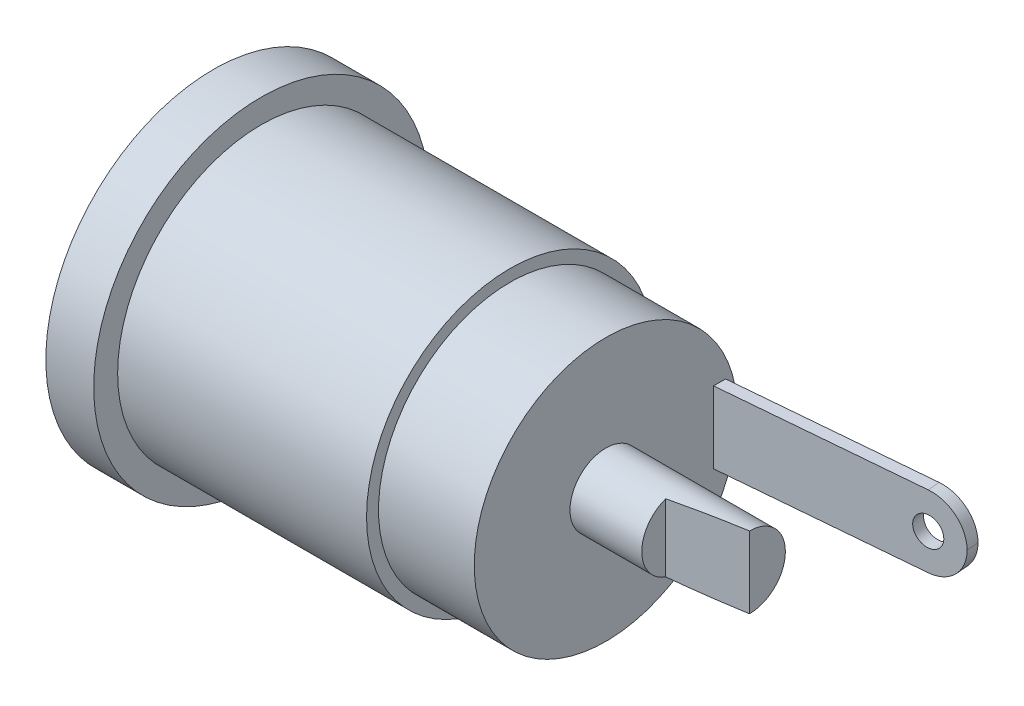
ISO-10303-21;
HEADER;
FILE_DESCRIPTION(('STEP AP214'),'2;1');
FILE_NAME('part.step','',(''),(''),'','','');
FILE_SCHEMA(('AUTOMOTIVE_DESIGN { 1 0 10303 214 1 1 1 1 }'));
ENDSEC;
DATA;
#1=APPLICATION_CONTEXT('core data for automotive mechanical design processes');
#2=APPLICATION_PROTOCOL_DEFINITION('international standard','automotive_design',2000,#1);
#3=PRODUCT_CONTEXT('',#1,'mechanical');
#4=PRODUCT('Part','Part','',(#3));
#5=PRODUCT_RELATED_PRODUCT_CATEGORY('part','',(#4));
#6=PRODUCT_DEFINITION_FORMATION('','',#4);
#7=PRODUCT_DEFINITION_CONTEXT('part definition',#1,'design');
#8=PRODUCT_DEFINITION('design','',#6,#7);
#9=PRODUCT_DEFINITION_SHAPE('','',#8);
#10=(LENGTH_UNIT() NAMED_UNIT(*) SI_UNIT(.MILLI.,.METRE.));
#11=(NAMED_UNIT(*) PLANE_ANGLE_UNIT() SI_UNIT($,.RADIAN.));
#12=(NAMED_UNIT(*) SI_UNIT($,.STERADIAN.) SOLID_ANGLE_UNIT());
#13=UNCERTAINTY_MEASURE_WITH_UNIT(LENGTH_MEASURE(1.E-05),#10,'distance_accuracy_value','');
#14=(GEOMETRIC_REPRESENTATION_CONTEXT(3) GLOBAL_UNCERTAINTY_ASSIGNED_CONTEXT((#13)) GLOBAL_UNIT_ASSIGNED_CONTEXT((#10,
#11,#12)) REPRESENTATION_CONTEXT('',''));
#15=CARTESIAN_POINT('',(0.,0.,0.));
#16=DIRECTION('',(0.,0.,1.));
#17=DIRECTION('',(1.,0.,0.));
#18=AXIS2_PLACEMENT_3D('',#15,#16,#17);
#19=CARTESIAN_POINT('',(16.4,0.,-5.5));
#20=DIRECTION('',(1.,0.,0.));
#21=DIRECTION('',(0.,0.,-1.));
#22=AXIS2_PLACEMENT_3D('',#19,#20,#21);
#23=PLANE('',#22);
#24=CARTESIAN_POINT('',(16.4,0.,0.));
#25=DIRECTION('',(1.,0.,0.));
#26=DIRECTION('',(0.,0.,-1.));
#27=AXIS2_PLACEMENT_3D('',#24,#25,#26);
#28=CIRCLE('',#27,1.5);
#29=CARTESIAN_POINT('',(16.4,0.,-1.49999999999999));
#30=VERTEX_POINT('',#29);
#31=EDGE_CURVE('E133',#30,#30,#28,.T.);
#32=ORIENTED_EDGE('',*,*,#31,.F.);
#33=EDGE_LOOP('',(#32));
#34=FACE_BOUND('',#33,.T.);
#35=CARTESIAN_POINT('',(16.4,0.,0.));
#36=DIRECTION('',(1.,0.,0.));
#37=DIRECTION('',(0.,0.,-1.));
#38=AXIS2_PLACEMENT_3D('',#35,#36,#37);
#39=CIRCLE('',#38,5.50000000000001);
#40=CARTESIAN_POINT('',(16.4,0.,-5.5));
#41=VERTEX_POINT('',#40);
#42=EDGE_CURVE('E138',#41,#41,#39,.T.);
#43=ORIENTED_EDGE('',*,*,#42,.T.);
#44=EDGE_LOOP('',(#43));
#45=FACE_BOUND('',#44,.T.);
#46=DIRECTION('',(0.,-1.,0.));
#47=VECTOR('',#46,1.);
#48=CARTESIAN_POINT('',(16.4,1.5,-4.49809008122833));
#49=LINE('',#48,#47);
#50=CARTESIAN_POINT('',(16.4,1.5,-4.49809008122833));
#51=VERTEX_POINT('',#50);
#52=CARTESIAN_POINT('',(16.4,-1.5,-4.49809008122833));
#53=VERTEX_POINT('',#52);
#54=EDGE_CURVE('E109',#51,#53,#49,.T.);
#55=ORIENTED_EDGE('',*,*,#54,.F.);
#56=DIRECTION('',(0.,0.,1.));
#57=VECTOR('',#56,1.);
#58=CARTESIAN_POINT('',(16.4,1.5,-4.49809008122833));
#59=LINE('',#58,#57);
#60=CARTESIAN_POINT('',(16.4,1.5,-5.));
#61=VERTEX_POINT('',#60);
#62=EDGE_CURVE('E102',#61,#51,#59,.T.);
#63=ORIENTED_EDGE('',*,*,#62,.F.);
#64=DIRECTION('',(0.,-1.,0.));
#65=VECTOR('',#64,1.);
#66=CARTESIAN_POINT('',(16.4,1.5,-5.));
#67=LINE('',#66,#65);
#68=CARTESIAN_POINT('',(16.4,-1.5,-5.));
#69=VERTEX_POINT('',#68);
#70=EDGE_CURVE('E98',#61,#69,#67,.T.);
#71=ORIENTED_EDGE('',*,*,#70,.T.);
#72=DIRECTION('',(0.,0.,1.));
#73=VECTOR('',#72,1.);
#74=CARTESIAN_POINT('',(16.4,-1.5,-4.49809008122833));
#75=LINE('',#74,#73);
#76=EDGE_CURVE('E107',#69,#53,#75,.T.);
#77=ORIENTED_EDGE('',*,*,#76,.T.);
#78=EDGE_LOOP('',(#55,#63,#71,#77));
#79=FACE_BOUND('',#78,.T.);
#80=ADVANCED_FACE('F35',(#34,#45,#79),#23,.T.);
#81=CARTESIAN_POINT('',(0.,0.,0.));
#82=DIRECTION('',(-1.,0.,0.));
#83=DIRECTION('',(0.,0.,1.));
#84=AXIS2_PLACEMENT_3D('',#81,#82,#83);
#85=PLANE('',#84);
#86=CARTESIAN_POINT('',(0.,0.,0.));
#87=DIRECTION('',(-1.,0.,0.));
#88=DIRECTION('',(0.,0.,1.));
#89=AXIS2_PLACEMENT_3D('',#86,#87,#88);
#90=CIRCLE('',#89,3.85000000000001);
#91=CARTESIAN_POINT('',(0.,0.,3.85000000000001));
#92=VERTEX_POINT('',#91);
#93=EDGE_CURVE('E159',#92,#92,#90,.F.);
#94=ORIENTED_EDGE('',*,*,#93,.T.);
#95=EDGE_LOOP('',(#94));
#96=FACE_BOUND('',#95,.T.);
#97=CARTESIAN_POINT('',(0.,0.,0.));
#98=DIRECTION('',(1.,0.,0.));
#99=DIRECTION('',(0.,0.,-1.));
#100=AXIS2_PLACEMENT_3D('',#97,#98,#99);
#101=CIRCLE('',#100,7.);
#102=CARTESIAN_POINT('',(0.,0.,-7.));
#103=VERTEX_POINT('',#102);
#104=EDGE_CURVE('E153',#103,#103,#101,.T.);
#105=ORIENTED_EDGE('',*,*,#104,.F.);
#106=EDGE_LOOP('',(#105));
#107=FACE_BOUND('',#106,.T.);
#108=ADVANCED_FACE('F192',(#96,#107),#85,.T.);
#109=CARTESIAN_POINT('',(16.4,0.,0.));
#110=DIRECTION('',(1.,0.,0.));
#111=DIRECTION('',(0.,0.,-1.));
#112=AXIS2_PLACEMENT_3D('',#109,#110,#111);
#113=CYLINDRICAL_SURFACE('',#112,7.);
#114=ORIENTED_EDGE('',*,*,#104,.T.);
#115=EDGE_LOOP('',(#114));
#116=FACE_BOUND('',#115,.T.);
#117=CARTESIAN_POINT('',(2.,0.,0.));
#118=DIRECTION('',(1.,0.,0.));
#119=DIRECTION('',(0.,0.,-1.));
#120=AXIS2_PLACEMENT_3D('',#117,#118,#119);
#121=CIRCLE('',#120,7.);
#122=CARTESIAN_POINT('',(2.,0.,-7.));
#123=VERTEX_POINT('',#122);
#124=EDGE_CURVE('E150',#123,#123,#121,.T.);
#125=ORIENTED_EDGE('',*,*,#124,.F.);
#126=EDGE_LOOP('',(#125));
#127=FACE_BOUND('',#126,.T.);
#128=ADVANCED_FACE('F198',(#116,#127),#113,.T.);
#129=CARTESIAN_POINT('',(2.,0.,-7.));
#130=DIRECTION('',(1.,0.,0.));
#131=DIRECTION('',(0.,0.,-1.));
#132=AXIS2_PLACEMENT_3D('',#129,#130,#131);
#133=PLANE('',#132);
#134=ORIENTED_EDGE('',*,*,#124,.T.);
#135=EDGE_LOOP('',(#134));
#136=FACE_BOUND('',#135,.T.);
#137=CARTESIAN_POINT('',(2.,0.,0.));
#138=DIRECTION('',(1.,0.,0.));
#139=DIRECTION('',(0.,0.,-1.));
#140=AXIS2_PLACEMENT_3D('',#137,#138,#139);
#141=CIRCLE('',#140,6.);
#142=CARTESIAN_POINT('',(2.,0.,-6.));
#143=VERTEX_POINT('',#142);
#144=EDGE_CURVE('E147',#143,#143,#141,.T.);
#145=ORIENTED_EDGE('',*,*,#144,.F.);
#146=EDGE_LOOP('',(#145));
#147=FACE_BOUND('',#146,.T.);
#148=ADVANCED_FACE('F218',(#136,#147),#133,.T.);
#149=CARTESIAN_POINT('',(16.4,0.,0.));
#150=DIRECTION('',(1.,0.,0.));
#151=DIRECTION('',(0.,0.,-1.));
#152=AXIS2_PLACEMENT_3D('',#149,#150,#151);
#153=CYLINDRICAL_SURFACE('',#152,6.);
#154=ORIENTED_EDGE('',*,*,#144,.T.);
#155=EDGE_LOOP('',(#154));
#156=FACE_BOUND('',#155,.T.);
#157=CARTESIAN_POINT('',(12.4,0.,0.));
#158=DIRECTION('',(1.,0.,0.));
#159=DIRECTION('',(0.,0.,-1.));
#160=AXIS2_PLACEMENT_3D('',#157,#158,#159);
#161=CIRCLE('',#160,6.);
#162=CARTESIAN_POINT('',(12.4,0.,-6.));
#163=VERTEX_POINT('',#162);
#164=EDGE_CURVE('E144',#163,#163,#161,.T.);
#165=ORIENTED_EDGE('',*,*,#164,.F.);
#166=EDGE_LOOP('',(#165));
#167=FACE_BOUND('',#166,.T.);
#168=ADVANCED_FACE('F214',(#156,#167),#153,.T.);
#169=CARTESIAN_POINT('',(12.4,0.,-6.));
#170=DIRECTION('',(1.,0.,0.));
#171=DIRECTION('',(0.,0.,-1.));
#172=AXIS2_PLACEMENT_3D('',#169,#170,#171);
#173=PLANE('',#172);
#174=ORIENTED_EDGE('',*,*,#164,.T.);
#175=EDGE_LOOP('',(#174));
#176=FACE_BOUND('',#175,.T.);
#177=CARTESIAN_POINT('',(12.4,0.,0.));
#178=DIRECTION('',(1.,0.,0.));
#179=DIRECTION('',(0.,0.,-1.));
#180=AXIS2_PLACEMENT_3D('',#177,#178,#179);
#181=CIRCLE('',#180,5.50000000000001);
#182=CARTESIAN_POINT('',(12.4,0.,-5.5));
#183=VERTEX_POINT('',#182);
#184=EDGE_CURVE('E141',#183,#183,#181,.T.);
#185=ORIENTED_EDGE('',*,*,#184,.F.);
#186=EDGE_LOOP('',(#185));
#187=FACE_BOUND('',#186,.T.);
#188=ADVANCED_FACE('F210',(#176,#187),#173,.T.);
#189=CARTESIAN_POINT('',(16.4,0.,0.));
#190=DIRECTION('',(1.,0.,0.));
#191=DIRECTION('',(0.,0.,-1.));
#192=AXIS2_PLACEMENT_3D('',#189,#190,#191);
#193=CYLINDRICAL_SURFACE('',#192,5.50000000000001);
#194=ORIENTED_EDGE('',*,*,#184,.T.);
#195=EDGE_LOOP('',(#194));
#196=FACE_BOUND('',#195,.T.);
#197=ORIENTED_EDGE('',*,*,#42,.F.);
#198=EDGE_LOOP('',(#197));
#199=FACE_BOUND('',#198,.T.);
#200=ADVANCED_FACE('F207',(#196,#199),#193,.T.);
#201=CARTESIAN_POINT('',(10.,0.,0.));
#202=DIRECTION('',(-1.,0.,0.));
#203=DIRECTION('',(0.,0.,1.));
#204=AXIS2_PLACEMENT_3D('',#201,#202,#203);
#205=CYLINDRICAL_SURFACE('',#204,2.85);
#206=CARTESIAN_POINT('',(0.999999999999997,0.,0.));
#207=DIRECTION('',(-1.,0.,0.));
#208=DIRECTION('',(0.,0.,1.));
#209=AXIS2_PLACEMENT_3D('',#206,#207,#208);
#210=CIRCLE('',#209,2.85);
#211=CARTESIAN_POINT('',(0.999999999999996,0.,2.85));
#212=VERTEX_POINT('',#211);
#213=EDGE_CURVE('E156',#212,#212,#210,.T.);
#214=ORIENTED_EDGE('',*,*,#213,.T.);
#215=EDGE_LOOP('',(#214));
#216=FACE_BOUND('',#215,.T.);
#217=CARTESIAN_POINT('',(10.,0.,0.));
#218=DIRECTION('',(-1.,0.,0.));
#219=DIRECTION('',(0.,0.,1.));
#220=AXIS2_PLACEMENT_3D('',#217,#218,#219);
#221=CIRCLE('',#220,2.85);
#222=CARTESIAN_POINT('',(10.,0.,2.85));
#223=VERTEX_POINT('',#222);
#224=EDGE_CURVE('E132',#223,#223,#221,.T.);
#225=ORIENTED_EDGE('',*,*,#224,.F.);
#226=EDGE_LOOP('',(#225));
#227=FACE_BOUND('',#226,.T.);
#228=ADVANCED_FACE('F205',(#216,#227),#205,.F.);
#229=CARTESIAN_POINT('',(10.,0.,0.));
#230=DIRECTION('',(-1.,0.,0.));
#231=DIRECTION('',(0.,0.,1.));
#232=AXIS2_PLACEMENT_3D('',#229,#230,#231);
#233=PLANE('',#232);
#234=ORIENTED_EDGE('',*,*,#224,.T.);
#235=EDGE_LOOP('',(#234));
#236=FACE_BOUND('',#235,.T.);
#237=ADVANCED_FACE('F229',(#236),#233,.T.);
#238=CARTESIAN_POINT('',(0.999999999999997,0.,0.));
#239=DIRECTION('',(-1.,0.,0.));
#240=DIRECTION('',(0.,0.,1.));
#241=AXIS2_PLACEMENT_3D('',#238,#239,#240);
#242=CONICAL_SURFACE('',#241,2.85,0.785398163397451);
#243=ORIENTED_EDGE('',*,*,#93,.F.);
#244=EDGE_LOOP('',(#243));
#245=FACE_BOUND('',#244,.T.);
#246=ORIENTED_EDGE('',*,*,#213,.F.);
#247=EDGE_LOOP('',(#246));
#248=FACE_BOUND('',#247,.T.);
#249=ADVANCED_FACE('F226',(#245,#248),#242,.F.);
#250=CARTESIAN_POINT('',(22.4,0.,0.));
#251=DIRECTION('',(-1.,0.,0.));
#252=DIRECTION('',(0.,0.,1.));
#253=AXIS2_PLACEMENT_3D('',#250,#251,#252);
#254=CYLINDRICAL_SURFACE('',#253,1.5);
#255=CARTESIAN_POINT('',(19.4,0.,0.));
#256=DIRECTION('',(-1.,0.,0.));
#257=DIRECTION('',(0.,0.,1.));
#258=AXIS2_PLACEMENT_3D('',#255,#256,#257);
#259=CIRCLE('',#258,1.5);
#260=CARTESIAN_POINT('',(19.4,-1.4142135623731,0.500000000000008));
#261=VERTEX_POINT('',#260);
#262=CARTESIAN_POINT('',(19.4,1.41421356237309,0.500000000000008));
#263=VERTEX_POINT('',#262);
#264=EDGE_CURVE('E164',#261,#263,#259,.T.);
#265=ORIENTED_EDGE('',*,*,#264,.T.);
#266=CARTESIAN_POINT('',(22.4,0.,0.));
#267=DIRECTION('',(-0.164398987305356,0.,-0.986393923832144));
#268=DIRECTION('',(-0.986393923832144,0.,0.164398987305356));
#269=AXIS2_PLACEMENT_3D('',#266,#267,#268);
#270=ELLIPSE('',#269,9.12414379544737,1.5);
#271=CARTESIAN_POINT('',(22.4,1.5,0.));
#272=VERTEX_POINT('',#271);
#273=EDGE_CURVE('E128',#263,#272,#270,.T.);
#274=ORIENTED_EDGE('',*,*,#273,.T.);
#275=CARTESIAN_POINT('',(22.4,0.,0.));
#276=DIRECTION('',(1.,0.,0.));
#277=DIRECTION('',(0.,0.,-1.));
#278=AXIS2_PLACEMENT_3D('',#275,#276,#277);
#279=CIRCLE('',#278,1.5);
#280=CARTESIAN_POINT('',(22.4,-1.5,0.));
#281=VERTEX_POINT('',#280);
#282=EDGE_CURVE('E129',#281,#272,#279,.T.);
#283=ORIENTED_EDGE('',*,*,#282,.F.);
#284=EDGE_CURVE('E125',#281,#261,#270,.T.);
#285=ORIENTED_EDGE('',*,*,#284,.T.);
#286=EDGE_LOOP('',(#265,#274,#283,#285));
#287=FACE_BOUND('',#286,.T.);
#288=ORIENTED_EDGE('',*,*,#31,.T.);
#289=EDGE_LOOP('',(#288));
#290=FACE_BOUND('',#289,.T.);
#291=ADVANCED_FACE('F228',(#287,#290),#254,.T.);
#292=CARTESIAN_POINT('',(22.4,0.,0.));
#293=DIRECTION('',(1.,0.,0.));
#294=DIRECTION('',(0.,0.,-1.));
#295=AXIS2_PLACEMENT_3D('',#292,#293,#294);
#296=PLANE('',#295);
#297=DIRECTION('',(0.,1.,0.));
#298=VECTOR('',#297,1.);
#299=CARTESIAN_POINT('',(22.4,0.,0.));
#300=LINE('',#299,#298);
#301=EDGE_CURVE('E162',#281,#272,#300,.T.);
#302=ORIENTED_EDGE('',*,*,#301,.F.);
#303=ORIENTED_EDGE('',*,*,#282,.T.);
#304=EDGE_LOOP('',(#302,#303));
#305=FACE_BOUND('',#304,.T.);
#306=ADVANCED_FACE('F235',(#305),#296,.T.);
#307=CARTESIAN_POINT('',(19.4,-7.,1.50000000000001));
#308=DIRECTION('',(-1.,0.,0.));
#309=DIRECTION('',(0.,0.,1.));
#310=AXIS2_PLACEMENT_3D('',#307,#308,#309);
#311=PLANE('',#310);
#312=ORIENTED_EDGE('',*,*,#264,.F.);
#313=DIRECTION('',(0.,1.,0.));
#314=VECTOR('',#313,1.);
#315=CARTESIAN_POINT('',(19.4,-7.,0.500000000000008));
#316=LINE('',#315,#314);
#317=EDGE_CURVE('E122',#261,#263,#316,.T.);
#318=ORIENTED_EDGE('',*,*,#317,.T.);
#319=EDGE_LOOP('',(#312,#318));
#320=FACE_BOUND('',#319,.T.);
#321=ADVANCED_FACE('F309',(#320),#311,.F.);
#322=CARTESIAN_POINT('',(19.4,-7.,0.500000000000008));
#323=DIRECTION('',(-0.164398987305356,0.,-0.986393923832144));
#324=DIRECTION('',(-0.986393923832144,0.,0.164398987305356));
#325=AXIS2_PLACEMENT_3D('',#322,#323,#324);
#326=PLANE('',#325);
#327=ORIENTED_EDGE('',*,*,#317,.F.);
#328=ORIENTED_EDGE('',*,*,#284,.F.);
#329=ORIENTED_EDGE('',*,*,#301,.T.);
#330=ORIENTED_EDGE('',*,*,#273,.F.);
#331=EDGE_LOOP('',(#327,#328,#329,#330));
#332=FACE_BOUND('',#331,.T.);
#333=ADVANCED_FACE('F318',(#332),#326,.F.);
#334=CARTESIAN_POINT('',(26.1435778713738,1.5,-5.35054268715553));
#335=DIRECTION('',(-0.0871557427476514,0.,-0.996194698091746));
#336=DIRECTION('',(-0.996194698091746,0.,0.0871557427476514));
#337=AXIS2_PLACEMENT_3D('',#334,#335,#336);
#338=PLANE('',#337);
#339=CARTESIAN_POINT('',(24.6492858242362,0.,-5.21980907303405));
#340=DIRECTION('',(-0.0871557427476514,0.,-0.996194698091746));
#341=DIRECTION('',(-0.996194698091746,0.,0.0871557427476514));
#342=AXIS2_PLACEMENT_3D('',#339,#340,#341);
#343=CIRCLE('',#342,0.600000000000002);
#344=CARTESIAN_POINT('',(24.0515690053812,0.,-5.16751562738546));
#345=VERTEX_POINT('',#344);
#346=EDGE_CURVE('E117',#345,#345,#343,.T.);
#347=ORIENTED_EDGE('',*,*,#346,.T.);
#348=EDGE_LOOP('',(#347));
#349=FACE_BOUND('',#348,.T.);
#350=CARTESIAN_POINT('',(24.6492858242362,0.,-5.21980907303405));
#351=DIRECTION('',(-0.0871557427476514,0.,-0.996194698091746));
#352=DIRECTION('',(-0.996194698091746,0.,0.0871557427476514));
#353=AXIS2_PLACEMENT_3D('',#350,#351,#352);
#354=CIRCLE('',#353,1.5);
#355=CARTESIAN_POINT('',(24.6492858242362,-1.5,-5.21980907303405));
#356=VERTEX_POINT('',#355);
#357=CARTESIAN_POINT('',(26.1435778713738,0.,-5.35054268715553));
#358=VERTEX_POINT('',#357);
#359=EDGE_CURVE('E51',#356,#358,#354,.F.);
#360=ORIENTED_EDGE('',*,*,#359,.T.);
#361=CARTESIAN_POINT('',(24.6492858242362,0.,-5.21980907303405));
#362=DIRECTION('',(-0.0871557427476514,0.,-0.996194698091746));
#363=DIRECTION('',(-0.996194698091746,0.,0.0871557427476514));
#364=AXIS2_PLACEMENT_3D('',#361,#362,#363);
#365=CIRCLE('',#364,1.5);
#366=CARTESIAN_POINT('',(24.6492858242362,1.5,-5.21980907303405));
#367=VERTEX_POINT('',#366);
#368=EDGE_CURVE('E44',#358,#367,#365,.F.);
#369=ORIENTED_EDGE('',*,*,#368,.T.);
#370=DIRECTION('',(0.996194698091746,0.,-0.0871557427476514));
#371=VECTOR('',#370,1.);
#372=CARTESIAN_POINT('',(26.1435778713738,1.5,-5.35054268715553));
#373=LINE('',#372,#371);
#374=EDGE_CURVE('E177',#51,#367,#373,.T.);
#375=ORIENTED_EDGE('',*,*,#374,.F.);
#376=ORIENTED_EDGE('',*,*,#54,.T.);
#377=DIRECTION('',(0.996194698091746,0.,-0.0871557427476514));
#378=VECTOR('',#377,1.);
#379=CARTESIAN_POINT('',(26.1435778713738,-1.5,-5.35054268715553));
#380=LINE('',#379,#378);
#381=EDGE_CURVE('E103',#53,#356,#380,.T.);
#382=ORIENTED_EDGE('',*,*,#381,.T.);
#383=EDGE_LOOP('',(#360,#369,#375,#376,#382));
#384=FACE_BOUND('',#383,.T.);
#385=ADVANCED_FACE('F176',(#349,#384),#338,.F.);
#386=CARTESIAN_POINT('',(16.4,1.5,-5.));
#387=DIRECTION('',(0.0871557427476516,0.,0.996194698091746));
#388=DIRECTION('',(0.996194698091746,0.,-0.0871557427476517));
#389=AXIS2_PLACEMENT_3D('',#386,#387,#388);
#390=PLANE('',#389);
#391=CARTESIAN_POINT('',(24.6057079528624,0.,-5.71790642207992));
#392=DIRECTION('',(-0.0871557427476517,0.,-0.996194698091746));
#393=DIRECTION('',(-0.996194698091746,0.,0.0871557427476517));
#394=AXIS2_PLACEMENT_3D('',#391,#392,#393);
#395=CIRCLE('',#394,0.600000000000002);
#396=CARTESIAN_POINT('',(24.0079911340073,0.,-5.66561297643133));
#397=VERTEX_POINT('',#396);
#398=EDGE_CURVE('E383',#397,#397,#395,.T.);
#399=ORIENTED_EDGE('',*,*,#398,.F.);
#400=EDGE_LOOP('',(#399));
#401=FACE_BOUND('',#400,.T.);
#402=DIRECTION('',(-0.996194698091746,0.,0.0871557427476517));
#403=VECTOR('',#402,1.);
#404=CARTESIAN_POINT('',(16.4,1.5,-5.));
#405=LINE('',#404,#403);
#406=CARTESIAN_POINT('',(24.6057079528624,1.5,-5.71790642207992));
#407=VERTEX_POINT('',#406);
#408=EDGE_CURVE('E110',#407,#61,#405,.T.);
#409=ORIENTED_EDGE('',*,*,#408,.F.);
#410=CARTESIAN_POINT('',(24.6057079528624,0.,-5.71790642207992));
#411=DIRECTION('',(0.0871557427476516,0.,0.996194698091746));
#412=DIRECTION('',(0.996194698091746,0.,-0.0871557427476517));
#413=AXIS2_PLACEMENT_3D('',#410,#411,#412);
#414=CIRCLE('',#413,1.5);
#415=CARTESIAN_POINT('',(26.1,0.,-5.8486400362014));
#416=VERTEX_POINT('',#415);
#417=EDGE_CURVE('E170',#407,#416,#414,.F.);
#418=ORIENTED_EDGE('',*,*,#417,.T.);
#419=CARTESIAN_POINT('',(24.6057079528624,0.,-5.71790642207992));
#420=DIRECTION('',(0.0871557427476516,0.,0.996194698091746));
#421=DIRECTION('',(0.996194698091746,0.,-0.0871557427476517));
#422=AXIS2_PLACEMENT_3D('',#419,#420,#421);
#423=CIRCLE('',#422,1.5);
#424=CARTESIAN_POINT('',(24.6057079528624,-1.5,-5.71790642207992));
#425=VERTEX_POINT('',#424);
#426=EDGE_CURVE('E100',#416,#425,#423,.F.);
#427=ORIENTED_EDGE('',*,*,#426,.T.);
#428=DIRECTION('',(-0.996194698091746,0.,0.0871557427476517));
#429=VECTOR('',#428,1.);
#430=CARTESIAN_POINT('',(16.4,-1.5,-5.));
#431=LINE('',#430,#429);
#432=EDGE_CURVE('E94',#425,#69,#431,.T.);
#433=ORIENTED_EDGE('',*,*,#432,.T.);
#434=ORIENTED_EDGE('',*,*,#70,.F.);
#435=EDGE_LOOP('',(#409,#418,#427,#433,#434));
#436=FACE_BOUND('',#435,.T.);
#437=ADVANCED_FACE('F97',(#401,#436),#390,.F.);
#438=CARTESIAN_POINT('',(0.,1.5,0.));
#439=DIRECTION('',(0.,-1.,0.));
#440=DIRECTION('',(0.,0.,-1.));
#441=AXIS2_PLACEMENT_3D('',#438,#439,#440);
#442=PLANE('',#441);
#443=ORIENTED_EDGE('',*,*,#374,.T.);
#444=DIRECTION('',(-0.0871557427476536,0.,-0.996194698091746));
#445=VECTOR('',#444,1.);
#446=CARTESIAN_POINT('',(24.9152519717298,1.5,-2.17980209641817));
#447=LINE('',#446,#445);
#448=EDGE_CURVE('E166',#367,#407,#447,.T.);
#449=ORIENTED_EDGE('',*,*,#448,.T.);
#450=ORIENTED_EDGE('',*,*,#408,.T.);
#451=ORIENTED_EDGE('',*,*,#62,.T.);
#452=EDGE_LOOP('',(#443,#449,#450,#451));
#453=FACE_BOUND('',#452,.T.);
#454=ADVANCED_FACE('F181',(#453),#442,.F.);
#455=CARTESIAN_POINT('',(0.,-1.5,0.));
#456=DIRECTION('',(0.,-1.,0.));
#457=DIRECTION('',(0.,0.,-1.));
#458=AXIS2_PLACEMENT_3D('',#455,#456,#457);
#459=PLANE('',#458);
#460=ORIENTED_EDGE('',*,*,#432,.F.);
#461=DIRECTION('',(-0.0871557427476536,0.,-0.996194698091746));
#462=VECTOR('',#461,1.);
#463=CARTESIAN_POINT('',(24.6492858242362,-1.5,-5.21980907303405));
#464=LINE('',#463,#462);
#465=EDGE_CURVE('E11',#425,#356,#464,.F.);
#466=ORIENTED_EDGE('',*,*,#465,.T.);
#467=ORIENTED_EDGE('',*,*,#381,.F.);
#468=ORIENTED_EDGE('',*,*,#76,.F.);
#469=EDGE_LOOP('',(#460,#466,#467,#468));
#470=FACE_BOUND('',#469,.T.);
#471=ADVANCED_FACE('F112',(#470),#459,.T.);
#472=CARTESIAN_POINT('',(24.6057079528624,0.,-5.71790642207992));
#473=DIRECTION('',(0.0871557427476536,0.,0.996194698091746));
#474=DIRECTION('',(0.996194698091746,0.,-0.0871557427476536));
#475=AXIS2_PLACEMENT_3D('',#472,#473,#474);
#476=CYLINDRICAL_SURFACE('',#475,1.5);
#477=DIRECTION('',(-0.0871557427476536,0.,-0.996194698091746));
#478=VECTOR('',#477,1.);
#479=CARTESIAN_POINT('',(26.1,0.,-5.8486400362014));
#480=LINE('',#479,#478);
#481=EDGE_CURVE('E39',#358,#416,#480,.T.);
#482=ORIENTED_EDGE('',*,*,#481,.F.);
#483=ORIENTED_EDGE('',*,*,#359,.F.);
#484=ORIENTED_EDGE('',*,*,#465,.F.);
#485=ORIENTED_EDGE('',*,*,#426,.F.);
#486=EDGE_LOOP('',(#482,#483,#484,#485));
#487=FACE_BOUND('',#486,.T.);
#488=ADVANCED_FACE('F37',(#487),#476,.T.);
#489=CARTESIAN_POINT('',(24.9152519717298,0.,-2.17980209641817));
#490=DIRECTION('',(-0.0871557427476536,0.,-0.996194698091746));
#491=DIRECTION('',(-0.996194698091746,0.,0.0871557427476536));
#492=AXIS2_PLACEMENT_3D('',#489,#490,#491);
#493=CYLINDRICAL_SURFACE('',#492,1.5);
#494=ORIENTED_EDGE('',*,*,#368,.F.);
#495=ORIENTED_EDGE('',*,*,#481,.T.);
#496=ORIENTED_EDGE('',*,*,#417,.F.);
#497=ORIENTED_EDGE('',*,*,#448,.F.);
#498=EDGE_LOOP('',(#494,#495,#496,#497));
#499=FACE_BOUND('',#498,.T.);
#500=ADVANCED_FACE('F182',(#499),#493,.T.);
#501=CARTESIAN_POINT('',(24.8671751811053,0.,-2.72932232780468));
#502=DIRECTION('',(-0.0871557427476516,0.,-0.996194698091746));
#503=DIRECTION('',(-0.996194698091746,0.,0.0871557427476517));
#504=AXIS2_PLACEMENT_3D('',#501,#502,#503);
#505=CYLINDRICAL_SURFACE('',#504,0.600000000000002);
#506=ORIENTED_EDGE('',*,*,#398,.T.);
#507=EDGE_LOOP('',(#506));
#508=FACE_BOUND('',#507,.T.);
#509=ORIENTED_EDGE('',*,*,#346,.F.);
#510=EDGE_LOOP('',(#509));
#511=FACE_BOUND('',#510,.T.);
#512=ADVANCED_FACE('F189',(#508,#511),#505,.F.);
#513=CLOSED_SHELL('',(#80,#108,#128,#148,#168,#188,#200,#228,#237,#249,#291,#306,#321,#333,#385,
#437,#454,#471,#488,#500,#512));
#514=MANIFOLD_SOLID_BREP('B2',#513);
#515=ADVANCED_BREP_SHAPE_REPRESENTATION('',(#18,#514),#14);
#516=SHAPE_DEFINITION_REPRESENTATION(#9,#515);
ENDSEC;
END-ISO-10303-21;
